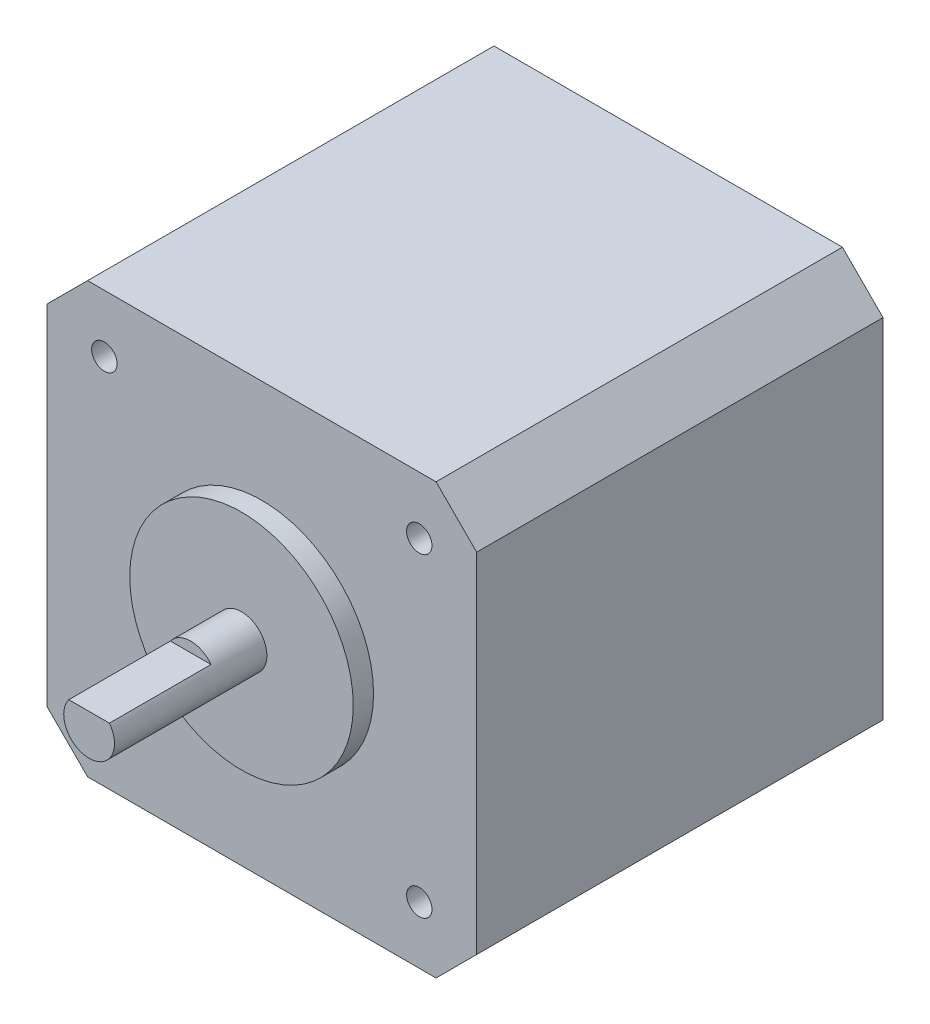
ISO-10303-21;
HEADER;
FILE_DESCRIPTION(('STEP AP214'),'2;1');
FILE_NAME('part.step','',(''),(''),'','','');
FILE_SCHEMA(('AUTOMOTIVE_DESIGN { 1 0 10303 214 1 1 1 1 }'));
ENDSEC;
DATA;
#1=APPLICATION_CONTEXT('core data for automotive mechanical design processes');
#2=APPLICATION_PROTOCOL_DEFINITION('international standard','automotive_design',2000,#1);
#3=PRODUCT_CONTEXT('',#1,'mechanical');
#4=PRODUCT('Part','Part','',(#3));
#5=PRODUCT_RELATED_PRODUCT_CATEGORY('part','',(#4));
#6=PRODUCT_DEFINITION_FORMATION('','',#4);
#7=PRODUCT_DEFINITION_CONTEXT('part definition',#1,'design');
#8=PRODUCT_DEFINITION('design','',#6,#7);
#9=PRODUCT_DEFINITION_SHAPE('','',#8);
#10=(LENGTH_UNIT() NAMED_UNIT(*) SI_UNIT(.MILLI.,.METRE.));
#11=(NAMED_UNIT(*) PLANE_ANGLE_UNIT() SI_UNIT($,.RADIAN.));
#12=(NAMED_UNIT(*) SI_UNIT($,.STERADIAN.) SOLID_ANGLE_UNIT());
#13=UNCERTAINTY_MEASURE_WITH_UNIT(LENGTH_MEASURE(1.E-05),#10,'distance_accuracy_value','');
#14=(GEOMETRIC_REPRESENTATION_CONTEXT(3) GLOBAL_UNCERTAINTY_ASSIGNED_CONTEXT((#13)) GLOBAL_UNIT_ASSIGNED_CONTEXT((#10,
#11,#12)) REPRESENTATION_CONTEXT('',''));
#15=CARTESIAN_POINT('',(0.,0.,0.));
#16=DIRECTION('',(0.,0.,1.));
#17=DIRECTION('',(1.,0.,0.));
#18=AXIS2_PLACEMENT_3D('',#15,#16,#17);
#19=CARTESIAN_POINT('',(0.,0.,42.));
#20=DIRECTION('',(0.,0.,1.));
#21=DIRECTION('',(1.,0.,0.));
#22=AXIS2_PLACEMENT_3D('',#19,#20,#21);
#23=PLANE('',#22);
#24=CARTESIAN_POINT('',(0.,0.,42.));
#25=DIRECTION('',(0.,0.,1.));
#26=DIRECTION('',(1.,0.,0.));
#27=AXIS2_PLACEMENT_3D('',#24,#25,#26);
#28=CIRCLE('',#27,11.);
#29=CARTESIAN_POINT('',(11.,0.,42.));
#30=VERTEX_POINT('',#29);
#31=EDGE_CURVE('E176',#30,#30,#28,.T.);
#32=ORIENTED_EDGE('',*,*,#31,.T.);
#33=EDGE_LOOP('',(#32));
#34=FACE_BOUND('',#33,.T.);
#35=CARTESIAN_POINT('',(0.,0.,42.));
#36=DIRECTION('',(0.,0.,1.));
#37=DIRECTION('',(1.,0.,0.));
#38=AXIS2_PLACEMENT_3D('',#35,#36,#37);
#39=CIRCLE('',#38,2.5);
#40=CARTESIAN_POINT('',(2.5,0.,42.));
#41=VERTEX_POINT('',#40);
#42=EDGE_CURVE('E169',#41,#41,#39,.T.);
#43=ORIENTED_EDGE('',*,*,#42,.F.);
#44=EDGE_LOOP('',(#43));
#45=FACE_BOUND('',#44,.T.);
#46=ADVANCED_FACE('F39',(#34,#45),#23,.T.);
#47=CARTESIAN_POINT('',(0.,0.,40.));
#48=DIRECTION('',(0.,0.,1.));
#49=DIRECTION('',(1.,0.,0.));
#50=AXIS2_PLACEMENT_3D('',#47,#48,#49);
#51=PLANE('',#50);
#52=CARTESIAN_POINT('',(-15.5,15.5,40.));
#53=DIRECTION('',(0.,0.,1.));
#54=DIRECTION('',(1.,0.,0.));
#55=AXIS2_PLACEMENT_3D('',#52,#53,#54);
#56=CIRCLE('',#55,1.24999999999999);
#57=CARTESIAN_POINT('',(-14.25,15.5,40.));
#58=VERTEX_POINT('',#57);
#59=EDGE_CURVE('E138',#58,#58,#56,.T.);
#60=ORIENTED_EDGE('',*,*,#59,.F.);
#61=EDGE_LOOP('',(#60));
#62=FACE_BOUND('',#61,.T.);
#63=CARTESIAN_POINT('',(-15.5,-15.5,40.));
#64=DIRECTION('',(0.,0.,1.));
#65=DIRECTION('',(1.,0.,0.));
#66=AXIS2_PLACEMENT_3D('',#63,#64,#65);
#67=CIRCLE('',#66,1.24999999999999);
#68=CARTESIAN_POINT('',(-14.25,-15.5,40.));
#69=VERTEX_POINT('',#68);
#70=EDGE_CURVE('E137',#69,#69,#67,.T.);
#71=ORIENTED_EDGE('',*,*,#70,.F.);
#72=EDGE_LOOP('',(#71));
#73=FACE_BOUND('',#72,.T.);
#74=CARTESIAN_POINT('',(15.5,-15.5,40.));
#75=DIRECTION('',(0.,0.,1.));
#76=DIRECTION('',(1.,0.,0.));
#77=AXIS2_PLACEMENT_3D('',#74,#75,#76);
#78=CIRCLE('',#77,1.24999999999999);
#79=CARTESIAN_POINT('',(16.75,-15.5,40.));
#80=VERTEX_POINT('',#79);
#81=EDGE_CURVE('E148',#80,#80,#78,.T.);
#82=ORIENTED_EDGE('',*,*,#81,.F.);
#83=EDGE_LOOP('',(#82));
#84=FACE_BOUND('',#83,.T.);
#85=CARTESIAN_POINT('',(15.5,15.5,40.));
#86=DIRECTION('',(0.,0.,1.));
#87=DIRECTION('',(1.,0.,0.));
#88=AXIS2_PLACEMENT_3D('',#85,#86,#87);
#89=CIRCLE('',#88,1.24999999999999);
#90=CARTESIAN_POINT('',(16.75,15.5,40.));
#91=VERTEX_POINT('',#90);
#92=EDGE_CURVE('E154',#91,#91,#89,.T.);
#93=ORIENTED_EDGE('',*,*,#92,.F.);
#94=EDGE_LOOP('',(#93));
#95=FACE_BOUND('',#94,.T.);
#96=DIRECTION('',(1.,0.,0.));
#97=VECTOR('',#96,1.);
#98=CARTESIAN_POINT('',(-21.15,-21.15,40.));
#99=LINE('',#98,#97);
#100=CARTESIAN_POINT('',(-17.15,-21.15,40.));
#101=VERTEX_POINT('',#100);
#102=CARTESIAN_POINT('',(17.15,-21.15,40.));
#103=VERTEX_POINT('',#102);
#104=EDGE_CURVE('E190',#101,#103,#99,.T.);
#105=ORIENTED_EDGE('',*,*,#104,.T.);
#106=DIRECTION('',(-0.707106781186549,-0.707106781186546,0.));
#107=VECTOR('',#106,1.);
#108=CARTESIAN_POINT('',(19.15,-19.15,40.));
#109=LINE('',#108,#107);
#110=CARTESIAN_POINT('',(21.15,-17.15,40.));
#111=VERTEX_POINT('',#110);
#112=EDGE_CURVE('E229',#103,#111,#109,.F.);
#113=ORIENTED_EDGE('',*,*,#112,.T.);
#114=DIRECTION('',(0.,1.,0.));
#115=VECTOR('',#114,1.);
#116=CARTESIAN_POINT('',(21.15,21.15,40.));
#117=LINE('',#116,#115);
#118=CARTESIAN_POINT('',(21.15,17.15,40.));
#119=VERTEX_POINT('',#118);
#120=EDGE_CURVE('E182',#111,#119,#117,.T.);
#121=ORIENTED_EDGE('',*,*,#120,.T.);
#122=DIRECTION('',(0.707106781186546,-0.707106781186549,0.));
#123=VECTOR('',#122,1.);
#124=CARTESIAN_POINT('',(19.15,19.15,40.));
#125=LINE('',#124,#123);
#126=CARTESIAN_POINT('',(17.15,21.15,40.));
#127=VERTEX_POINT('',#126);
#128=EDGE_CURVE('E224',#119,#127,#125,.F.);
#129=ORIENTED_EDGE('',*,*,#128,.T.);
#130=DIRECTION('',(-1.,0.,0.));
#131=VECTOR('',#130,1.);
#132=CARTESIAN_POINT('',(-21.15,21.15,40.));
#133=LINE('',#132,#131);
#134=CARTESIAN_POINT('',(-17.15,21.15,40.));
#135=VERTEX_POINT('',#134);
#136=EDGE_CURVE('E185',#127,#135,#133,.T.);
#137=ORIENTED_EDGE('',*,*,#136,.T.);
#138=DIRECTION('',(0.707106781186549,0.707106781186546,0.));
#139=VECTOR('',#138,1.);
#140=CARTESIAN_POINT('',(-19.15,19.15,40.));
#141=LINE('',#140,#139);
#142=CARTESIAN_POINT('',(-21.15,17.15,40.));
#143=VERTEX_POINT('',#142);
#144=EDGE_CURVE('E61',#135,#143,#141,.F.);
#145=ORIENTED_EDGE('',*,*,#144,.T.);
#146=DIRECTION('',(0.,-1.,0.));
#147=VECTOR('',#146,1.);
#148=CARTESIAN_POINT('',(-21.15,21.15,40.));
#149=LINE('',#148,#147);
#150=CARTESIAN_POINT('',(-21.15,-17.15,40.));
#151=VERTEX_POINT('',#150);
#152=EDGE_CURVE('E188',#143,#151,#149,.T.);
#153=ORIENTED_EDGE('',*,*,#152,.T.);
#154=DIRECTION('',(-0.707106781186546,0.707106781186549,0.));
#155=VECTOR('',#154,1.);
#156=CARTESIAN_POINT('',(-19.15,-19.15,40.));
#157=LINE('',#156,#155);
#158=EDGE_CURVE('E227',#151,#101,#157,.F.);
#159=ORIENTED_EDGE('',*,*,#158,.T.);
#160=EDGE_LOOP('',(#105,#113,#121,#129,#137,#145,#153,#159));
#161=FACE_BOUND('',#160,.T.);
#162=CARTESIAN_POINT('',(0.,0.,40.));
#163=DIRECTION('',(0.,0.,1.));
#164=DIRECTION('',(1.,0.,0.));
#165=AXIS2_PLACEMENT_3D('',#162,#163,#164);
#166=CIRCLE('',#165,11.);
#167=CARTESIAN_POINT('',(11.,0.,40.));
#168=VERTEX_POINT('',#167);
#169=EDGE_CURVE('E173',#168,#168,#166,.T.);
#170=ORIENTED_EDGE('',*,*,#169,.F.);
#171=EDGE_LOOP('',(#170));
#172=FACE_BOUND('',#171,.T.);
#173=ADVANCED_FACE('F252',(#62,#73,#84,#95,#161,#172),#51,.T.);
#174=CARTESIAN_POINT('',(21.15,21.15,40.));
#175=DIRECTION('',(-1.,0.,0.));
#176=DIRECTION('',(0.,-1.,0.));
#177=AXIS2_PLACEMENT_3D('',#174,#175,#176);
#178=PLANE('',#177);
#179=ORIENTED_EDGE('',*,*,#120,.F.);
#180=DIRECTION('',(0.,0.,-1.));
#181=VECTOR('',#180,1.);
#182=CARTESIAN_POINT('',(21.15,-17.15,40.));
#183=LINE('',#182,#181);
#184=CARTESIAN_POINT('',(21.15,-17.15,0.));
#185=VERTEX_POINT('',#184);
#186=EDGE_CURVE('E208',#111,#185,#183,.T.);
#187=ORIENTED_EDGE('',*,*,#186,.T.);
#188=DIRECTION('',(0.,1.,0.));
#189=VECTOR('',#188,1.);
#190=CARTESIAN_POINT('',(21.15,21.15,0.));
#191=LINE('',#190,#189);
#192=CARTESIAN_POINT('',(21.15,17.15,0.));
#193=VERTEX_POINT('',#192);
#194=EDGE_CURVE('E179',#185,#193,#191,.T.);
#195=ORIENTED_EDGE('',*,*,#194,.T.);
#196=DIRECTION('',(0.,0.,1.));
#197=VECTOR('',#196,1.);
#198=CARTESIAN_POINT('',(21.15,17.15,40.));
#199=LINE('',#198,#197);
#200=EDGE_CURVE('E206',#193,#119,#199,.T.);
#201=ORIENTED_EDGE('',*,*,#200,.T.);
#202=EDGE_LOOP('',(#179,#187,#195,#201));
#203=FACE_BOUND('',#202,.T.);
#204=ADVANCED_FACE('F268',(#203),#178,.F.);
#205=CARTESIAN_POINT('',(-21.15,21.15,40.));
#206=DIRECTION('',(0.,-1.,0.));
#207=DIRECTION('',(0.,0.,-1.));
#208=AXIS2_PLACEMENT_3D('',#205,#206,#207);
#209=PLANE('',#208);
#210=DIRECTION('',(-1.,0.,0.));
#211=VECTOR('',#210,1.);
#212=CARTESIAN_POINT('',(-21.15,21.15,0.));
#213=LINE('',#212,#211);
#214=CARTESIAN_POINT('',(17.15,21.15,0.));
#215=VERTEX_POINT('',#214);
#216=CARTESIAN_POINT('',(-17.15,21.15,0.));
#217=VERTEX_POINT('',#216);
#218=EDGE_CURVE('E196',#215,#217,#213,.T.);
#219=ORIENTED_EDGE('',*,*,#218,.T.);
#220=DIRECTION('',(0.,0.,1.));
#221=VECTOR('',#220,1.);
#222=CARTESIAN_POINT('',(-17.15,21.15,40.));
#223=LINE('',#222,#221);
#224=EDGE_CURVE('E11',#217,#135,#223,.T.);
#225=ORIENTED_EDGE('',*,*,#224,.T.);
#226=ORIENTED_EDGE('',*,*,#136,.F.);
#227=DIRECTION('',(0.,0.,-1.));
#228=VECTOR('',#227,1.);
#229=CARTESIAN_POINT('',(17.15,21.15,40.));
#230=LINE('',#229,#228);
#231=EDGE_CURVE('E47',#127,#215,#230,.T.);
#232=ORIENTED_EDGE('',*,*,#231,.T.);
#233=EDGE_LOOP('',(#219,#225,#226,#232));
#234=FACE_BOUND('',#233,.T.);
#235=ADVANCED_FACE('F239',(#234),#209,.F.);
#236=CARTESIAN_POINT('',(-21.15,21.15,40.));
#237=DIRECTION('',(1.,0.,0.));
#238=DIRECTION('',(0.,1.,0.));
#239=AXIS2_PLACEMENT_3D('',#236,#237,#238);
#240=PLANE('',#239);
#241=DIRECTION('',(0.,-1.,0.));
#242=VECTOR('',#241,1.);
#243=CARTESIAN_POINT('',(-21.15,21.15,0.));
#244=LINE('',#243,#242);
#245=CARTESIAN_POINT('',(-21.15,17.15,0.));
#246=VERTEX_POINT('',#245);
#247=CARTESIAN_POINT('',(-21.15,-17.15,0.));
#248=VERTEX_POINT('',#247);
#249=EDGE_CURVE('E199',#246,#248,#244,.T.);
#250=ORIENTED_EDGE('',*,*,#249,.T.);
#251=DIRECTION('',(0.,0.,1.));
#252=VECTOR('',#251,1.);
#253=CARTESIAN_POINT('',(-21.15,-17.15,40.));
#254=LINE('',#253,#252);
#255=EDGE_CURVE('E54',#248,#151,#254,.T.);
#256=ORIENTED_EDGE('',*,*,#255,.T.);
#257=ORIENTED_EDGE('',*,*,#152,.F.);
#258=DIRECTION('',(0.,0.,-1.));
#259=VECTOR('',#258,1.);
#260=CARTESIAN_POINT('',(-21.15,17.15,40.));
#261=LINE('',#260,#259);
#262=EDGE_CURVE('E231',#143,#246,#261,.T.);
#263=ORIENTED_EDGE('',*,*,#262,.T.);
#264=EDGE_LOOP('',(#250,#256,#257,#263));
#265=FACE_BOUND('',#264,.T.);
#266=ADVANCED_FACE('F250',(#265),#240,.F.);
#267=CARTESIAN_POINT('',(-21.15,-21.15,40.));
#268=DIRECTION('',(0.,1.,0.));
#269=DIRECTION('',(0.,0.,1.));
#270=AXIS2_PLACEMENT_3D('',#267,#268,#269);
#271=PLANE('',#270);
#272=DIRECTION('',(1.,0.,0.));
#273=VECTOR('',#272,1.);
#274=CARTESIAN_POINT('',(-21.15,-21.15,0.));
#275=LINE('',#274,#273);
#276=CARTESIAN_POINT('',(-17.15,-21.15,0.));
#277=VERTEX_POINT('',#276);
#278=CARTESIAN_POINT('',(17.15,-21.15,0.));
#279=VERTEX_POINT('',#278);
#280=EDGE_CURVE('E186',#277,#279,#275,.T.);
#281=ORIENTED_EDGE('',*,*,#280,.T.);
#282=DIRECTION('',(0.,0.,1.));
#283=VECTOR('',#282,1.);
#284=CARTESIAN_POINT('',(17.15,-21.15,40.));
#285=LINE('',#284,#283);
#286=EDGE_CURVE('E222',#279,#103,#285,.T.);
#287=ORIENTED_EDGE('',*,*,#286,.T.);
#288=ORIENTED_EDGE('',*,*,#104,.F.);
#289=DIRECTION('',(0.,0.,-1.));
#290=VECTOR('',#289,1.);
#291=CARTESIAN_POINT('',(-17.15,-21.15,40.));
#292=LINE('',#291,#290);
#293=EDGE_CURVE('E219',#101,#277,#292,.T.);
#294=ORIENTED_EDGE('',*,*,#293,.T.);
#295=EDGE_LOOP('',(#281,#287,#288,#294));
#296=FACE_BOUND('',#295,.T.);
#297=ADVANCED_FACE('F260',(#296),#271,.F.);
#298=CARTESIAN_POINT('',(0.,0.,0.));
#299=DIRECTION('',(0.,0.,1.));
#300=DIRECTION('',(1.,0.,0.));
#301=AXIS2_PLACEMENT_3D('',#298,#299,#300);
#302=PLANE('',#301);
#303=ORIENTED_EDGE('',*,*,#194,.F.);
#304=DIRECTION('',(0.707106781186549,0.707106781186546,0.));
#305=VECTOR('',#304,1.);
#306=CARTESIAN_POINT('',(21.15,-17.15,0.));
#307=LINE('',#306,#305);
#308=EDGE_CURVE('E217',#185,#279,#307,.F.);
#309=ORIENTED_EDGE('',*,*,#308,.T.);
#310=ORIENTED_EDGE('',*,*,#280,.F.);
#311=DIRECTION('',(0.707106781186546,-0.707106781186549,0.));
#312=VECTOR('',#311,1.);
#313=CARTESIAN_POINT('',(-17.15,-21.15,0.));
#314=LINE('',#313,#312);
#315=EDGE_CURVE('E215',#277,#248,#314,.F.);
#316=ORIENTED_EDGE('',*,*,#315,.T.);
#317=ORIENTED_EDGE('',*,*,#249,.F.);
#318=DIRECTION('',(-0.707106781186549,-0.707106781186546,0.));
#319=VECTOR('',#318,1.);
#320=CARTESIAN_POINT('',(-21.15,17.15,0.));
#321=LINE('',#320,#319);
#322=EDGE_CURVE('E213',#246,#217,#321,.F.);
#323=ORIENTED_EDGE('',*,*,#322,.T.);
#324=ORIENTED_EDGE('',*,*,#218,.F.);
#325=DIRECTION('',(-0.707106781186546,0.707106781186549,0.));
#326=VECTOR('',#325,1.);
#327=CARTESIAN_POINT('',(17.15,21.15,0.));
#328=LINE('',#327,#326);
#329=EDGE_CURVE('E211',#215,#193,#328,.F.);
#330=ORIENTED_EDGE('',*,*,#329,.T.);
#331=EDGE_LOOP('',(#303,#309,#310,#316,#317,#323,#324,#330));
#332=FACE_BOUND('',#331,.T.);
#333=ADVANCED_FACE('F245',(#332),#302,.F.);
#334=CARTESIAN_POINT('',(0.,0.,42.));
#335=DIRECTION('',(0.,0.,-1.));
#336=DIRECTION('',(-1.,0.,0.));
#337=AXIS2_PLACEMENT_3D('',#334,#335,#336);
#338=CYLINDRICAL_SURFACE('',#337,11.);
#339=ORIENTED_EDGE('',*,*,#31,.F.);
#340=EDGE_LOOP('',(#339));
#341=FACE_BOUND('',#340,.T.);
#342=ORIENTED_EDGE('',*,*,#169,.T.);
#343=EDGE_LOOP('',(#342));
#344=FACE_BOUND('',#343,.T.);
#345=ADVANCED_FACE('F292',(#341,#344),#338,.T.);
#346=CARTESIAN_POINT('',(0.,0.,57.));
#347=DIRECTION('',(0.,0.,-1.));
#348=DIRECTION('',(-1.,0.,0.));
#349=AXIS2_PLACEMENT_3D('',#346,#347,#348);
#350=CYLINDRICAL_SURFACE('',#349,2.5);
#351=CARTESIAN_POINT('',(0.,0.,57.));
#352=DIRECTION('',(0.,0.,1.));
#353=DIRECTION('',(1.,0.,0.));
#354=AXIS2_PLACEMENT_3D('',#351,#352,#353);
#355=CIRCLE('',#354,2.5);
#356=CARTESIAN_POINT('',(-2.,1.5,57.));
#357=VERTEX_POINT('',#356);
#358=CARTESIAN_POINT('',(2.,1.5,57.));
#359=VERTEX_POINT('',#358);
#360=EDGE_CURVE('E170',#357,#359,#355,.T.);
#361=ORIENTED_EDGE('',*,*,#360,.F.);
#362=DIRECTION('',(0.,0.,-1.));
#363=VECTOR('',#362,1.);
#364=CARTESIAN_POINT('',(-2.,1.5,57.));
#365=LINE('',#364,#363);
#366=CARTESIAN_POINT('',(-2.,1.5,47.));
#367=VERTEX_POINT('',#366);
#368=EDGE_CURVE('E166',#357,#367,#365,.T.);
#369=ORIENTED_EDGE('',*,*,#368,.T.);
#370=CARTESIAN_POINT('',(0.,0.,47.));
#371=DIRECTION('',(0.,0.,1.));
#372=DIRECTION('',(1.,0.,0.));
#373=AXIS2_PLACEMENT_3D('',#370,#371,#372);
#374=CIRCLE('',#373,2.5);
#375=CARTESIAN_POINT('',(2.,1.5,47.));
#376=VERTEX_POINT('',#375);
#377=EDGE_CURVE('E204',#376,#367,#374,.T.);
#378=ORIENTED_EDGE('',*,*,#377,.F.);
#379=DIRECTION('',(0.,0.,-1.));
#380=VECTOR('',#379,1.);
#381=CARTESIAN_POINT('',(2.,1.5,57.));
#382=LINE('',#381,#380);
#383=EDGE_CURVE('E163',#376,#359,#382,.F.);
#384=ORIENTED_EDGE('',*,*,#383,.T.);
#385=EDGE_LOOP('',(#361,#369,#378,#384));
#386=FACE_BOUND('',#385,.T.);
#387=ORIENTED_EDGE('',*,*,#42,.T.);
#388=EDGE_LOOP('',(#387));
#389=FACE_BOUND('',#388,.T.);
#390=ADVANCED_FACE('F290',(#386,#389),#350,.T.);
#391=CARTESIAN_POINT('',(0.,0.,57.));
#392=DIRECTION('',(0.,0.,1.));
#393=DIRECTION('',(1.,0.,0.));
#394=AXIS2_PLACEMENT_3D('',#391,#392,#393);
#395=PLANE('',#394);
#396=DIRECTION('',(1.,0.,0.));
#397=VECTOR('',#396,1.);
#398=CARTESIAN_POINT('',(0.,1.5,57.));
#399=LINE('',#398,#397);
#400=EDGE_CURVE('E193',#357,#359,#399,.T.);
#401=ORIENTED_EDGE('',*,*,#400,.F.);
#402=ORIENTED_EDGE('',*,*,#360,.T.);
#403=EDGE_LOOP('',(#401,#402));
#404=FACE_BOUND('',#403,.T.);
#405=ADVANCED_FACE('F424',(#404),#395,.T.);
#406=CARTESIAN_POINT('',(-11.,11.2019549832846,47.));
#407=DIRECTION('',(0.,0.,1.));
#408=DIRECTION('',(1.,0.,0.));
#409=AXIS2_PLACEMENT_3D('',#406,#407,#408);
#410=PLANE('',#409);
#411=ORIENTED_EDGE('',*,*,#377,.T.);
#412=DIRECTION('',(1.,0.,0.));
#413=VECTOR('',#412,1.);
#414=CARTESIAN_POINT('',(-11.,1.5,47.));
#415=LINE('',#414,#413);
#416=EDGE_CURVE('E160',#367,#376,#415,.T.);
#417=ORIENTED_EDGE('',*,*,#416,.T.);
#418=EDGE_LOOP('',(#411,#417));
#419=FACE_BOUND('',#418,.T.);
#420=ADVANCED_FACE('F421',(#419),#410,.T.);
#421=CARTESIAN_POINT('',(-11.,1.5,69.3139344245349));
#422=DIRECTION('',(0.,-1.,0.));
#423=DIRECTION('',(0.,0.,-1.));
#424=AXIS2_PLACEMENT_3D('',#421,#422,#423);
#425=PLANE('',#424);
#426=ORIENTED_EDGE('',*,*,#400,.T.);
#427=ORIENTED_EDGE('',*,*,#383,.F.);
#428=ORIENTED_EDGE('',*,*,#416,.F.);
#429=ORIENTED_EDGE('',*,*,#368,.F.);
#430=EDGE_LOOP('',(#426,#427,#428,#429));
#431=FACE_BOUND('',#430,.T.);
#432=ADVANCED_FACE('F308',(#431),#425,.F.);
#433=CARTESIAN_POINT('',(21.15,-17.15,40.));
#434=DIRECTION('',(-0.707106781186546,0.707106781186549,0.));
#435=DIRECTION('',(0.,0.,-1.));
#436=AXIS2_PLACEMENT_3D('',#433,#434,#435);
#437=PLANE('',#436);
#438=ORIENTED_EDGE('',*,*,#112,.F.);
#439=ORIENTED_EDGE('',*,*,#286,.F.);
#440=ORIENTED_EDGE('',*,*,#308,.F.);
#441=ORIENTED_EDGE('',*,*,#186,.F.);
#442=EDGE_LOOP('',(#438,#439,#440,#441));
#443=FACE_BOUND('',#442,.T.);
#444=ADVANCED_FACE('F265',(#443),#437,.F.);
#445=CARTESIAN_POINT('',(-17.15,-21.15,40.));
#446=DIRECTION('',(0.707106781186549,0.707106781186546,0.));
#447=DIRECTION('',(0.,0.,-1.));
#448=AXIS2_PLACEMENT_3D('',#445,#446,#447);
#449=PLANE('',#448);
#450=ORIENTED_EDGE('',*,*,#158,.F.);
#451=ORIENTED_EDGE('',*,*,#255,.F.);
#452=ORIENTED_EDGE('',*,*,#315,.F.);
#453=ORIENTED_EDGE('',*,*,#293,.F.);
#454=EDGE_LOOP('',(#450,#451,#452,#453));
#455=FACE_BOUND('',#454,.T.);
#456=ADVANCED_FACE('F257',(#455),#449,.F.);
#457=CARTESIAN_POINT('',(-21.15,17.15,40.));
#458=DIRECTION('',(0.707106781186546,-0.707106781186549,0.));
#459=DIRECTION('',(0.,0.,-1.));
#460=AXIS2_PLACEMENT_3D('',#457,#458,#459);
#461=PLANE('',#460);
#462=ORIENTED_EDGE('',*,*,#144,.F.);
#463=ORIENTED_EDGE('',*,*,#224,.F.);
#464=ORIENTED_EDGE('',*,*,#322,.F.);
#465=ORIENTED_EDGE('',*,*,#262,.F.);
#466=EDGE_LOOP('',(#462,#463,#464,#465));
#467=FACE_BOUND('',#466,.T.);
#468=ADVANCED_FACE('F249',(#467),#461,.F.);
#469=CARTESIAN_POINT('',(17.15,21.15,40.));
#470=DIRECTION('',(-0.707106781186549,-0.707106781186546,0.));
#471=DIRECTION('',(0.,0.,-1.));
#472=AXIS2_PLACEMENT_3D('',#469,#470,#471);
#473=PLANE('',#472);
#474=ORIENTED_EDGE('',*,*,#128,.F.);
#475=ORIENTED_EDGE('',*,*,#200,.F.);
#476=ORIENTED_EDGE('',*,*,#329,.F.);
#477=ORIENTED_EDGE('',*,*,#231,.F.);
#478=EDGE_LOOP('',(#474,#475,#476,#477));
#479=FACE_BOUND('',#478,.T.);
#480=ADVANCED_FACE('F41',(#479),#473,.F.);
#481=CARTESIAN_POINT('',(15.5,15.5,32.5));
#482=DIRECTION('',(0.,0.,1.));
#483=DIRECTION('',(1.,0.,0.));
#484=AXIS2_PLACEMENT_3D('',#481,#482,#483);
#485=CONICAL_SURFACE('',#484,1.24999999999999,1.02974425867665);
#486=CARTESIAN_POINT('',(15.5,15.5,31.7489242262155));
#487=VERTEX_POINT('',#486);
#488=VERTEX_LOOP('',#487);
#489=FACE_BOUND('',#488,.T.);
#490=CARTESIAN_POINT('',(15.5,15.5,32.5));
#491=DIRECTION('',(0.,0.,1.));
#492=DIRECTION('',(1.,0.,0.));
#493=AXIS2_PLACEMENT_3D('',#490,#491,#492);
#494=CIRCLE('',#493,1.24999999999999);
#495=CARTESIAN_POINT('',(16.75,15.5,32.5));
#496=VERTEX_POINT('',#495);
#497=EDGE_CURVE('E157',#496,#496,#494,.T.);
#498=ORIENTED_EDGE('',*,*,#497,.T.);
#499=EDGE_LOOP('',(#498));
#500=FACE_BOUND('',#499,.T.);
#501=ADVANCED_FACE('F271',(#489,#500),#485,.F.);
#502=CARTESIAN_POINT('',(15.5,15.5,40.));
#503=DIRECTION('',(0.,0.,1.));
#504=DIRECTION('',(1.,0.,0.));
#505=AXIS2_PLACEMENT_3D('',#502,#503,#504);
#506=CYLINDRICAL_SURFACE('',#505,1.24999999999999);
#507=ORIENTED_EDGE('',*,*,#497,.F.);
#508=EDGE_LOOP('',(#507));
#509=FACE_BOUND('',#508,.T.);
#510=ORIENTED_EDGE('',*,*,#92,.T.);
#511=EDGE_LOOP('',(#510));
#512=FACE_BOUND('',#511,.T.);
#513=ADVANCED_FACE('F276',(#509,#512),#506,.F.);
#514=CARTESIAN_POINT('',(15.5,-15.5,32.5));
#515=DIRECTION('',(0.,0.,1.));
#516=DIRECTION('',(1.,0.,0.));
#517=AXIS2_PLACEMENT_3D('',#514,#515,#516);
#518=CONICAL_SURFACE('',#517,1.24999999999999,1.02974425867665);
#519=CARTESIAN_POINT('',(15.5,-15.5,31.7489242262155));
#520=VERTEX_POINT('',#519);
#521=VERTEX_LOOP('',#520);
#522=FACE_BOUND('',#521,.T.);
#523=CARTESIAN_POINT('',(15.5,-15.5,32.5));
#524=DIRECTION('',(0.,0.,1.));
#525=DIRECTION('',(1.,0.,0.));
#526=AXIS2_PLACEMENT_3D('',#523,#524,#525);
#527=CIRCLE('',#526,1.24999999999999);
#528=CARTESIAN_POINT('',(16.75,-15.5,32.5));
#529=VERTEX_POINT('',#528);
#530=EDGE_CURVE('E151',#529,#529,#527,.T.);
#531=ORIENTED_EDGE('',*,*,#530,.T.);
#532=EDGE_LOOP('',(#531));
#533=FACE_BOUND('',#532,.T.);
#534=ADVANCED_FACE('F347',(#522,#533),#518,.F.);
#535=CARTESIAN_POINT('',(15.5,-15.5,40.));
#536=DIRECTION('',(0.,0.,1.));
#537=DIRECTION('',(1.,0.,0.));
#538=AXIS2_PLACEMENT_3D('',#535,#536,#537);
#539=CYLINDRICAL_SURFACE('',#538,1.24999999999999);
#540=ORIENTED_EDGE('',*,*,#530,.F.);
#541=EDGE_LOOP('',(#540));
#542=FACE_BOUND('',#541,.T.);
#543=ORIENTED_EDGE('',*,*,#81,.T.);
#544=EDGE_LOOP('',(#543));
#545=FACE_BOUND('',#544,.T.);
#546=ADVANCED_FACE('F359',(#542,#545),#539,.F.);
#547=CARTESIAN_POINT('',(-15.5,-15.5,32.5));
#548=DIRECTION('',(0.,0.,1.));
#549=DIRECTION('',(1.,0.,0.));
#550=AXIS2_PLACEMENT_3D('',#547,#548,#549);
#551=CONICAL_SURFACE('',#550,1.24999999999999,1.02974425867665);
#552=CARTESIAN_POINT('',(-15.5,-15.5,31.7489242262155));
#553=VERTEX_POINT('',#552);
#554=VERTEX_LOOP('',#553);
#555=FACE_BOUND('',#554,.T.);
#556=CARTESIAN_POINT('',(-15.5,-15.5,32.5));
#557=DIRECTION('',(0.,0.,1.));
#558=DIRECTION('',(1.,0.,0.));
#559=AXIS2_PLACEMENT_3D('',#556,#557,#558);
#560=CIRCLE('',#559,1.24999999999999);
#561=CARTESIAN_POINT('',(-14.25,-15.5,32.5));
#562=VERTEX_POINT('',#561);
#563=EDGE_CURVE('E141',#562,#562,#560,.T.);
#564=ORIENTED_EDGE('',*,*,#563,.T.);
#565=EDGE_LOOP('',(#564));
#566=FACE_BOUND('',#565,.T.);
#567=ADVANCED_FACE('F369',(#555,#566),#551,.F.);
#568=CARTESIAN_POINT('',(-15.5,-15.5,40.));
#569=DIRECTION('',(0.,0.,1.));
#570=DIRECTION('',(1.,0.,0.));
#571=AXIS2_PLACEMENT_3D('',#568,#569,#570);
#572=CYLINDRICAL_SURFACE('',#571,1.24999999999999);
#573=ORIENTED_EDGE('',*,*,#563,.F.);
#574=EDGE_LOOP('',(#573));
#575=FACE_BOUND('',#574,.T.);
#576=ORIENTED_EDGE('',*,*,#70,.T.);
#577=EDGE_LOOP('',(#576));
#578=FACE_BOUND('',#577,.T.);
#579=ADVANCED_FACE('F131',(#575,#578),#572,.F.);
#580=CARTESIAN_POINT('',(-15.5,15.5,32.5));
#581=DIRECTION('',(0.,0.,1.));
#582=DIRECTION('',(1.,0.,0.));
#583=AXIS2_PLACEMENT_3D('',#580,#581,#582);
#584=CONICAL_SURFACE('',#583,1.24999999999999,1.02974425867665);
#585=CARTESIAN_POINT('',(-15.5,15.5,31.7489242262155));
#586=VERTEX_POINT('',#585);
#587=VERTEX_LOOP('',#586);
#588=FACE_BOUND('',#587,.T.);
#589=CARTESIAN_POINT('',(-15.5,15.5,32.5));
#590=DIRECTION('',(0.,0.,1.));
#591=DIRECTION('',(1.,0.,0.));
#592=AXIS2_PLACEMENT_3D('',#589,#590,#591);
#593=CIRCLE('',#592,1.24999999999999);
#594=CARTESIAN_POINT('',(-14.25,15.5,32.5));
#595=VERTEX_POINT('',#594);
#596=EDGE_CURVE('E135',#595,#595,#593,.T.);
#597=ORIENTED_EDGE('',*,*,#596,.T.);
#598=EDGE_LOOP('',(#597));
#599=FACE_BOUND('',#598,.T.);
#600=ADVANCED_FACE('F127',(#588,#599),#584,.F.);
#601=CARTESIAN_POINT('',(-15.5,15.5,40.));
#602=DIRECTION('',(0.,0.,1.));
#603=DIRECTION('',(1.,0.,0.));
#604=AXIS2_PLACEMENT_3D('',#601,#602,#603);
#605=CYLINDRICAL_SURFACE('',#604,1.24999999999999);
#606=ORIENTED_EDGE('',*,*,#596,.F.);
#607=EDGE_LOOP('',(#606));
#608=FACE_BOUND('',#607,.T.);
#609=ORIENTED_EDGE('',*,*,#59,.T.);
#610=EDGE_LOOP('',(#609));
#611=FACE_BOUND('',#610,.T.);
#612=ADVANCED_FACE('F130',(#608,#611),#605,.F.);
#613=CLOSED_SHELL('',(#46,#173,#204,#235,#266,#297,#333,#345,#390,#405,#420,#432,#444,#456,#468,
#480,#501,#513,#534,#546,#567,#579,#600,#612));
#614=MANIFOLD_SOLID_BREP('B2',#613);
#615=ADVANCED_BREP_SHAPE_REPRESENTATION('',(#18,#614),#14);
#616=SHAPE_DEFINITION_REPRESENTATION(#9,#615);
ENDSEC;
END-ISO-10303-21;
